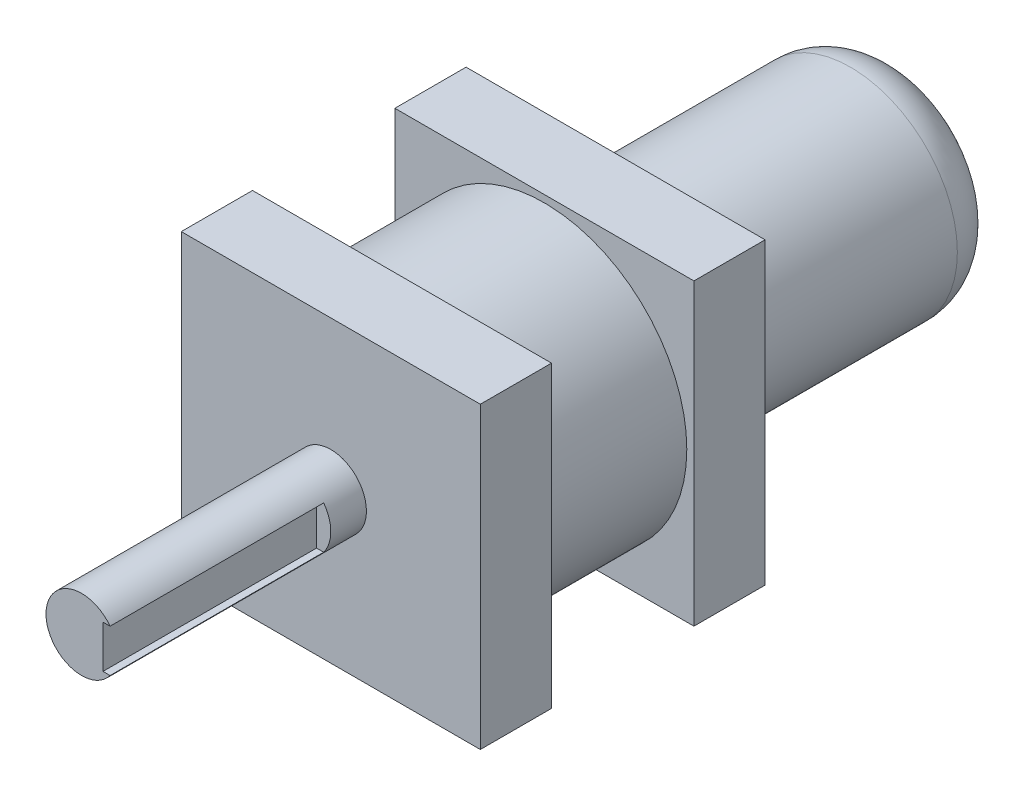
ISO-10303-21;
HEADER;
FILE_DESCRIPTION(('STEP AP214'),'2;1');
FILE_NAME('part.step','',(''),(''),'','','');
FILE_SCHEMA(('AUTOMOTIVE_DESIGN { 1 0 10303 214 1 1 1 1 }'));
ENDSEC;
DATA;
#1=APPLICATION_CONTEXT('core data for automotive mechanical design processes');
#2=APPLICATION_PROTOCOL_DEFINITION('international standard','automotive_design',2000,#1);
#3=PRODUCT_CONTEXT('',#1,'mechanical');
#4=PRODUCT('Part','Part','',(#3));
#5=PRODUCT_RELATED_PRODUCT_CATEGORY('part','',(#4));
#6=PRODUCT_DEFINITION_FORMATION('','',#4);
#7=PRODUCT_DEFINITION_CONTEXT('part definition',#1,'design');
#8=PRODUCT_DEFINITION('design','',#6,#7);
#9=PRODUCT_DEFINITION_SHAPE('','',#8);
#10=(LENGTH_UNIT() NAMED_UNIT(*) SI_UNIT(.MILLI.,.METRE.));
#11=(NAMED_UNIT(*) PLANE_ANGLE_UNIT() SI_UNIT($,.RADIAN.));
#12=(NAMED_UNIT(*) SI_UNIT($,.STERADIAN.) SOLID_ANGLE_UNIT());
#13=UNCERTAINTY_MEASURE_WITH_UNIT(LENGTH_MEASURE(1.E-05),#10,'distance_accuracy_value','');
#14=(GEOMETRIC_REPRESENTATION_CONTEXT(3) GLOBAL_UNCERTAINTY_ASSIGNED_CONTEXT((#13)) GLOBAL_UNIT_ASSIGNED_CONTEXT((#10,
#11,#12)) REPRESENTATION_CONTEXT('',''));
#15=CARTESIAN_POINT('',(0.,0.,0.));
#16=DIRECTION('',(0.,0.,1.));
#17=DIRECTION('',(1.,0.,0.));
#18=AXIS2_PLACEMENT_3D('',#15,#16,#17);
#19=CARTESIAN_POINT('',(0.,0.,40.));
#20=DIRECTION('',(0.,0.,-1.));
#21=DIRECTION('',(-1.,0.,0.));
#22=AXIS2_PLACEMENT_3D('',#19,#20,#21);
#23=CYLINDRICAL_SURFACE('',#22,15.);
#24=CARTESIAN_POINT('',(0.,0.,7.));
#25=DIRECTION('',(0.,0.,1.));
#26=DIRECTION('',(1.,0.,0.));
#27=AXIS2_PLACEMENT_3D('',#24,#25,#26);
#28=CIRCLE('',#27,15.);
#29=CARTESIAN_POINT('',(15.,0.,7.));
#30=VERTEX_POINT('',#29);
#31=EDGE_CURVE('E179',#30,#30,#28,.T.);
#32=ORIENTED_EDGE('',*,*,#31,.T.);
#33=EDGE_LOOP('',(#32));
#34=FACE_BOUND('',#33,.T.);
#35=CARTESIAN_POINT('',(0.,0.,40.));
#36=DIRECTION('',(0.,0.,1.));
#37=DIRECTION('',(1.,0.,0.));
#38=AXIS2_PLACEMENT_3D('',#35,#36,#37);
#39=CIRCLE('',#38,15.);
#40=CARTESIAN_POINT('',(15.,0.,40.));
#41=VERTEX_POINT('',#40);
#42=EDGE_CURVE('E216',#41,#41,#39,.T.);
#43=ORIENTED_EDGE('',*,*,#42,.F.);
#44=EDGE_LOOP('',(#43));
#45=FACE_BOUND('',#44,.T.);
#46=ADVANCED_FACE('F43',(#34,#45),#23,.T.);
#47=CARTESIAN_POINT('',(0.,0.,0.));
#48=DIRECTION('',(0.,0.,1.));
#49=DIRECTION('',(1.,0.,0.));
#50=AXIS2_PLACEMENT_3D('',#47,#48,#49);
#51=PLANE('',#50);
#52=CARTESIAN_POINT('',(0.,0.,0.));
#53=DIRECTION('',(0.,0.,1.));
#54=DIRECTION('',(1.,0.,0.));
#55=AXIS2_PLACEMENT_3D('',#52,#53,#54);
#56=CIRCLE('',#55,1.25);
#57=CARTESIAN_POINT('',(1.25,0.,0.));
#58=VERTEX_POINT('',#57);
#59=EDGE_CURVE('E246',#58,#58,#56,.F.);
#60=ORIENTED_EDGE('',*,*,#59,.F.);
#61=EDGE_LOOP('',(#60));
#62=FACE_BOUND('',#61,.T.);
#63=CARTESIAN_POINT('',(0.,0.,0.));
#64=DIRECTION('',(0.,0.,1.));
#65=DIRECTION('',(1.,0.,0.));
#66=AXIS2_PLACEMENT_3D('',#63,#64,#65);
#67=CIRCLE('',#66,8.);
#68=CARTESIAN_POINT('',(8.,0.,0.));
#69=VERTEX_POINT('',#68);
#70=EDGE_CURVE('E243',#69,#69,#67,.F.);
#71=ORIENTED_EDGE('',*,*,#70,.T.);
#72=EDGE_LOOP('',(#71));
#73=FACE_BOUND('',#72,.T.);
#74=ADVANCED_FACE('F273',(#62,#73),#51,.F.);
#75=CARTESIAN_POINT('',(21.,21.,50.));
#76=DIRECTION('',(-1.,0.,0.));
#77=DIRECTION('',(0.,-1.,0.));
#78=AXIS2_PLACEMENT_3D('',#75,#76,#77);
#79=PLANE('',#78);
#80=DIRECTION('',(0.,1.,0.));
#81=VECTOR('',#80,1.);
#82=CARTESIAN_POINT('',(21.,21.,40.));
#83=LINE('',#82,#81);
#84=CARTESIAN_POINT('',(21.,-21.,40.));
#85=VERTEX_POINT('',#84);
#86=CARTESIAN_POINT('',(21.,21.,40.));
#87=VERTEX_POINT('',#86);
#88=EDGE_CURVE('E213',#85,#87,#83,.T.);
#89=ORIENTED_EDGE('',*,*,#88,.T.);
#90=DIRECTION('',(0.,0.,-1.));
#91=VECTOR('',#90,1.);
#92=CARTESIAN_POINT('',(21.,21.,50.));
#93=LINE('',#92,#91);
#94=CARTESIAN_POINT('',(21.,21.,50.));
#95=VERTEX_POINT('',#94);
#96=EDGE_CURVE('E237',#95,#87,#93,.T.);
#97=ORIENTED_EDGE('',*,*,#96,.F.);
#98=DIRECTION('',(0.,1.,0.));
#99=VECTOR('',#98,1.);
#100=CARTESIAN_POINT('',(21.,21.,50.));
#101=LINE('',#100,#99);
#102=CARTESIAN_POINT('',(21.,-21.,50.));
#103=VERTEX_POINT('',#102);
#104=EDGE_CURVE('E217',#103,#95,#101,.T.);
#105=ORIENTED_EDGE('',*,*,#104,.F.);
#106=DIRECTION('',(0.,0.,-1.));
#107=VECTOR('',#106,1.);
#108=CARTESIAN_POINT('',(21.,-21.,50.));
#109=LINE('',#108,#107);
#110=EDGE_CURVE('E223',#103,#85,#109,.T.);
#111=ORIENTED_EDGE('',*,*,#110,.T.);
#112=EDGE_LOOP('',(#89,#97,#105,#111));
#113=FACE_BOUND('',#112,.T.);
#114=ADVANCED_FACE('F281',(#113),#79,.F.);
#115=CARTESIAN_POINT('',(-21.,21.,50.));
#116=DIRECTION('',(0.,-1.,0.));
#117=DIRECTION('',(0.,0.,-1.));
#118=AXIS2_PLACEMENT_3D('',#115,#116,#117);
#119=PLANE('',#118);
#120=DIRECTION('',(-1.,0.,0.));
#121=VECTOR('',#120,1.);
#122=CARTESIAN_POINT('',(-21.,21.,40.));
#123=LINE('',#122,#121);
#124=CARTESIAN_POINT('',(-21.,21.,40.));
#125=VERTEX_POINT('',#124);
#126=EDGE_CURVE('E226',#87,#125,#123,.T.);
#127=ORIENTED_EDGE('',*,*,#126,.T.);
#128=DIRECTION('',(0.,0.,-1.));
#129=VECTOR('',#128,1.);
#130=CARTESIAN_POINT('',(-21.,21.,50.));
#131=LINE('',#130,#129);
#132=CARTESIAN_POINT('',(-21.,21.,50.));
#133=VERTEX_POINT('',#132);
#134=EDGE_CURVE('E234',#133,#125,#131,.T.);
#135=ORIENTED_EDGE('',*,*,#134,.F.);
#136=DIRECTION('',(-1.,0.,0.));
#137=VECTOR('',#136,1.);
#138=CARTESIAN_POINT('',(-21.,21.,50.));
#139=LINE('',#138,#137);
#140=EDGE_CURVE('E96',#95,#133,#139,.T.);
#141=ORIENTED_EDGE('',*,*,#140,.F.);
#142=ORIENTED_EDGE('',*,*,#96,.T.);
#143=EDGE_LOOP('',(#127,#135,#141,#142));
#144=FACE_BOUND('',#143,.T.);
#145=ADVANCED_FACE('F347',(#144),#119,.F.);
#146=CARTESIAN_POINT('',(-21.,21.,50.));
#147=DIRECTION('',(1.,0.,0.));
#148=DIRECTION('',(0.,1.,0.));
#149=AXIS2_PLACEMENT_3D('',#146,#147,#148);
#150=PLANE('',#149);
#151=DIRECTION('',(0.,-1.,0.));
#152=VECTOR('',#151,1.);
#153=CARTESIAN_POINT('',(-21.,21.,40.));
#154=LINE('',#153,#152);
#155=CARTESIAN_POINT('',(-21.,-21.,40.));
#156=VERTEX_POINT('',#155);
#157=EDGE_CURVE('E228',#125,#156,#154,.T.);
#158=ORIENTED_EDGE('',*,*,#157,.T.);
#159=DIRECTION('',(0.,0.,-1.));
#160=VECTOR('',#159,1.);
#161=CARTESIAN_POINT('',(-21.,-21.,50.));
#162=LINE('',#161,#160);
#163=CARTESIAN_POINT('',(-21.,-21.,50.));
#164=VERTEX_POINT('',#163);
#165=EDGE_CURVE('E232',#164,#156,#162,.T.);
#166=ORIENTED_EDGE('',*,*,#165,.F.);
#167=DIRECTION('',(0.,-1.,0.));
#168=VECTOR('',#167,1.);
#169=CARTESIAN_POINT('',(-21.,21.,50.));
#170=LINE('',#169,#168);
#171=EDGE_CURVE('E220',#133,#164,#170,.T.);
#172=ORIENTED_EDGE('',*,*,#171,.F.);
#173=ORIENTED_EDGE('',*,*,#134,.T.);
#174=EDGE_LOOP('',(#158,#166,#172,#173));
#175=FACE_BOUND('',#174,.T.);
#176=ADVANCED_FACE('F344',(#175),#150,.F.);
#177=CARTESIAN_POINT('',(-21.,-21.,50.));
#178=DIRECTION('',(0.,1.,0.));
#179=DIRECTION('',(0.,0.,1.));
#180=AXIS2_PLACEMENT_3D('',#177,#178,#179);
#181=PLANE('',#180);
#182=DIRECTION('',(1.,0.,0.));
#183=VECTOR('',#182,1.);
#184=CARTESIAN_POINT('',(-21.,-21.,40.));
#185=LINE('',#184,#183);
#186=EDGE_CURVE('E88',#156,#85,#185,.T.);
#187=ORIENTED_EDGE('',*,*,#186,.T.);
#188=ORIENTED_EDGE('',*,*,#110,.F.);
#189=DIRECTION('',(1.,0.,0.));
#190=VECTOR('',#189,1.);
#191=CARTESIAN_POINT('',(-21.,-21.,50.));
#192=LINE('',#191,#190);
#193=EDGE_CURVE('E67',#164,#103,#192,.T.);
#194=ORIENTED_EDGE('',*,*,#193,.F.);
#195=ORIENTED_EDGE('',*,*,#165,.T.);
#196=EDGE_LOOP('',(#187,#188,#194,#195));
#197=FACE_BOUND('',#196,.T.);
#198=ADVANCED_FACE('F337',(#197),#181,.F.);
#199=CARTESIAN_POINT('',(0.,0.,50.));
#200=DIRECTION('',(0.,0.,1.));
#201=DIRECTION('',(1.,0.,0.));
#202=AXIS2_PLACEMENT_3D('',#199,#200,#201);
#203=PLANE('',#202);
#204=CARTESIAN_POINT('',(0.,0.,50.));
#205=DIRECTION('',(0.,0.,1.));
#206=DIRECTION('',(1.,0.,0.));
#207=AXIS2_PLACEMENT_3D('',#204,#205,#206);
#208=CIRCLE('',#207,20.);
#209=CARTESIAN_POINT('',(20.,0.,50.));
#210=VERTEX_POINT('',#209);
#211=EDGE_CURVE('E180',#210,#210,#208,.T.);
#212=ORIENTED_EDGE('',*,*,#211,.F.);
#213=EDGE_LOOP('',(#212));
#214=FACE_BOUND('',#213,.T.);
#215=ORIENTED_EDGE('',*,*,#104,.T.);
#216=ORIENTED_EDGE('',*,*,#140,.T.);
#217=ORIENTED_EDGE('',*,*,#171,.T.);
#218=ORIENTED_EDGE('',*,*,#193,.T.);
#219=EDGE_LOOP('',(#215,#216,#217,#218));
#220=FACE_BOUND('',#219,.T.);
#221=ADVANCED_FACE('F334',(#214,#220),#203,.T.);
#222=CARTESIAN_POINT('',(0.,0.,40.));
#223=DIRECTION('',(0.,0.,1.));
#224=DIRECTION('',(1.,0.,0.));
#225=AXIS2_PLACEMENT_3D('',#222,#223,#224);
#226=PLANE('',#225);
#227=ORIENTED_EDGE('',*,*,#42,.T.);
#228=EDGE_LOOP('',(#227));
#229=FACE_BOUND('',#228,.T.);
#230=ORIENTED_EDGE('',*,*,#88,.F.);
#231=ORIENTED_EDGE('',*,*,#186,.F.);
#232=ORIENTED_EDGE('',*,*,#157,.F.);
#233=ORIENTED_EDGE('',*,*,#126,.F.);
#234=EDGE_LOOP('',(#230,#231,#232,#233));
#235=FACE_BOUND('',#234,.T.);
#236=ADVANCED_FACE('F332',(#229,#235),#226,.F.);
#237=CARTESIAN_POINT('',(0.,0.,70.));
#238=DIRECTION('',(0.,0.,-1.));
#239=DIRECTION('',(-1.,0.,0.));
#240=AXIS2_PLACEMENT_3D('',#237,#238,#239);
#241=CYLINDRICAL_SURFACE('',#240,20.);
#242=CARTESIAN_POINT('',(0.,0.,70.));
#243=DIRECTION('',(0.,0.,1.));
#244=DIRECTION('',(1.,0.,0.));
#245=AXIS2_PLACEMENT_3D('',#242,#243,#244);
#246=CIRCLE('',#245,20.);
#247=CARTESIAN_POINT('',(20.,0.,70.));
#248=VERTEX_POINT('',#247);
#249=EDGE_CURVE('E210',#248,#248,#246,.T.);
#250=ORIENTED_EDGE('',*,*,#249,.F.);
#251=EDGE_LOOP('',(#250));
#252=FACE_BOUND('',#251,.T.);
#253=ORIENTED_EDGE('',*,*,#211,.T.);
#254=EDGE_LOOP('',(#253));
#255=FACE_BOUND('',#254,.T.);
#256=ADVANCED_FACE('F328',(#252,#255),#241,.T.);
#257=CARTESIAN_POINT('',(21.,21.,80.));
#258=DIRECTION('',(-1.,0.,0.));
#259=DIRECTION('',(0.,0.,1.));
#260=AXIS2_PLACEMENT_3D('',#257,#258,#259);
#261=PLANE('',#260);
#262=DIRECTION('',(0.,1.,0.));
#263=VECTOR('',#262,1.);
#264=CARTESIAN_POINT('',(21.,21.,70.));
#265=LINE('',#264,#263);
#266=CARTESIAN_POINT('',(21.,-21.,70.));
#267=VERTEX_POINT('',#266);
#268=CARTESIAN_POINT('',(21.,21.,70.));
#269=VERTEX_POINT('',#268);
#270=EDGE_CURVE('E175',#267,#269,#265,.T.);
#271=ORIENTED_EDGE('',*,*,#270,.T.);
#272=DIRECTION('',(0.,0.,-1.));
#273=VECTOR('',#272,1.);
#274=CARTESIAN_POINT('',(21.,21.,80.));
#275=LINE('',#274,#273);
#276=CARTESIAN_POINT('',(21.,21.,80.));
#277=VERTEX_POINT('',#276);
#278=EDGE_CURVE('E207',#277,#269,#275,.T.);
#279=ORIENTED_EDGE('',*,*,#278,.F.);
#280=DIRECTION('',(0.,1.,0.));
#281=VECTOR('',#280,1.);
#282=CARTESIAN_POINT('',(21.,21.,80.));
#283=LINE('',#282,#281);
#284=CARTESIAN_POINT('',(21.,-21.,80.));
#285=VERTEX_POINT('',#284);
#286=EDGE_CURVE('E181',#285,#277,#283,.T.);
#287=ORIENTED_EDGE('',*,*,#286,.F.);
#288=DIRECTION('',(0.,0.,-1.));
#289=VECTOR('',#288,1.);
#290=CARTESIAN_POINT('',(21.,-21.,80.));
#291=LINE('',#290,#289);
#292=EDGE_CURVE('E191',#285,#267,#291,.T.);
#293=ORIENTED_EDGE('',*,*,#292,.T.);
#294=EDGE_LOOP('',(#271,#279,#287,#293));
#295=FACE_BOUND('',#294,.T.);
#296=ADVANCED_FACE('F324',(#295),#261,.F.);
#297=CARTESIAN_POINT('',(-21.,21.,80.));
#298=DIRECTION('',(0.,-1.,0.));
#299=DIRECTION('',(0.,0.,-1.));
#300=AXIS2_PLACEMENT_3D('',#297,#298,#299);
#301=PLANE('',#300);
#302=DIRECTION('',(-1.,0.,0.));
#303=VECTOR('',#302,1.);
#304=CARTESIAN_POINT('',(-21.,21.,70.));
#305=LINE('',#304,#303);
#306=CARTESIAN_POINT('',(-21.,21.,70.));
#307=VERTEX_POINT('',#306);
#308=EDGE_CURVE('E194',#269,#307,#305,.T.);
#309=ORIENTED_EDGE('',*,*,#308,.T.);
#310=DIRECTION('',(0.,0.,-1.));
#311=VECTOR('',#310,1.);
#312=CARTESIAN_POINT('',(-21.,21.,80.));
#313=LINE('',#312,#311);
#314=CARTESIAN_POINT('',(-21.,21.,80.));
#315=VERTEX_POINT('',#314);
#316=EDGE_CURVE('E204',#315,#307,#313,.T.);
#317=ORIENTED_EDGE('',*,*,#316,.F.);
#318=DIRECTION('',(-1.,0.,0.));
#319=VECTOR('',#318,1.);
#320=CARTESIAN_POINT('',(-21.,21.,80.));
#321=LINE('',#320,#319);
#322=EDGE_CURVE('E184',#277,#315,#321,.T.);
#323=ORIENTED_EDGE('',*,*,#322,.F.);
#324=ORIENTED_EDGE('',*,*,#278,.T.);
#325=EDGE_LOOP('',(#309,#317,#323,#324));
#326=FACE_BOUND('',#325,.T.);
#327=ADVANCED_FACE('F320',(#326),#301,.F.);
#328=CARTESIAN_POINT('',(-21.,21.,80.));
#329=DIRECTION('',(1.,0.,0.));
#330=DIRECTION('',(0.,0.,-1.));
#331=AXIS2_PLACEMENT_3D('',#328,#329,#330);
#332=PLANE('',#331);
#333=DIRECTION('',(0.,-1.,0.));
#334=VECTOR('',#333,1.);
#335=CARTESIAN_POINT('',(-21.,21.,70.));
#336=LINE('',#335,#334);
#337=CARTESIAN_POINT('',(-21.,-21.,70.));
#338=VERTEX_POINT('',#337);
#339=EDGE_CURVE('E196',#307,#338,#336,.T.);
#340=ORIENTED_EDGE('',*,*,#339,.T.);
#341=DIRECTION('',(0.,0.,-1.));
#342=VECTOR('',#341,1.);
#343=CARTESIAN_POINT('',(-21.,-21.,80.));
#344=LINE('',#343,#342);
#345=CARTESIAN_POINT('',(-21.,-21.,80.));
#346=VERTEX_POINT('',#345);
#347=EDGE_CURVE('E201',#346,#338,#344,.T.);
#348=ORIENTED_EDGE('',*,*,#347,.F.);
#349=DIRECTION('',(0.,-1.,0.));
#350=VECTOR('',#349,1.);
#351=CARTESIAN_POINT('',(-21.,21.,80.));
#352=LINE('',#351,#350);
#353=EDGE_CURVE('E187',#315,#346,#352,.T.);
#354=ORIENTED_EDGE('',*,*,#353,.F.);
#355=ORIENTED_EDGE('',*,*,#316,.T.);
#356=EDGE_LOOP('',(#340,#348,#354,#355));
#357=FACE_BOUND('',#356,.T.);
#358=ADVANCED_FACE('F316',(#357),#332,.F.);
#359=CARTESIAN_POINT('',(-21.,-21.,80.));
#360=DIRECTION('',(0.,1.,0.));
#361=DIRECTION('',(0.,0.,1.));
#362=AXIS2_PLACEMENT_3D('',#359,#360,#361);
#363=PLANE('',#362);
#364=DIRECTION('',(1.,0.,0.));
#365=VECTOR('',#364,1.);
#366=CARTESIAN_POINT('',(-21.,-21.,70.));
#367=LINE('',#366,#365);
#368=EDGE_CURVE('E185',#338,#267,#367,.T.);
#369=ORIENTED_EDGE('',*,*,#368,.T.);
#370=ORIENTED_EDGE('',*,*,#292,.F.);
#371=DIRECTION('',(1.,0.,0.));
#372=VECTOR('',#371,1.);
#373=CARTESIAN_POINT('',(-21.,-21.,80.));
#374=LINE('',#373,#372);
#375=EDGE_CURVE('E189',#346,#285,#374,.T.);
#376=ORIENTED_EDGE('',*,*,#375,.F.);
#377=ORIENTED_EDGE('',*,*,#347,.T.);
#378=EDGE_LOOP('',(#369,#370,#376,#377));
#379=FACE_BOUND('',#378,.T.);
#380=ADVANCED_FACE('F309',(#379),#363,.F.);
#381=CARTESIAN_POINT('',(0.,0.,80.));
#382=DIRECTION('',(0.,0.,1.));
#383=DIRECTION('',(1.,0.,0.));
#384=AXIS2_PLACEMENT_3D('',#381,#382,#383);
#385=PLANE('',#384);
#386=CARTESIAN_POINT('',(0.,0.,80.));
#387=DIRECTION('',(0.,0.,1.));
#388=DIRECTION('',(1.,0.,0.));
#389=AXIS2_PLACEMENT_3D('',#386,#387,#388);
#390=CIRCLE('',#389,5.);
#391=CARTESIAN_POINT('',(5.,0.,80.));
#392=VERTEX_POINT('',#391);
#393=EDGE_CURVE('E176',#392,#392,#390,.T.);
#394=ORIENTED_EDGE('',*,*,#393,.F.);
#395=EDGE_LOOP('',(#394));
#396=FACE_BOUND('',#395,.T.);
#397=ORIENTED_EDGE('',*,*,#286,.T.);
#398=ORIENTED_EDGE('',*,*,#322,.T.);
#399=ORIENTED_EDGE('',*,*,#353,.T.);
#400=ORIENTED_EDGE('',*,*,#375,.T.);
#401=EDGE_LOOP('',(#397,#398,#399,#400));
#402=FACE_BOUND('',#401,.T.);
#403=ADVANCED_FACE('F307',(#396,#402),#385,.T.);
#404=CARTESIAN_POINT('',(0.,0.,70.));
#405=DIRECTION('',(0.,0.,1.));
#406=DIRECTION('',(1.,0.,0.));
#407=AXIS2_PLACEMENT_3D('',#404,#405,#406);
#408=PLANE('',#407);
#409=ORIENTED_EDGE('',*,*,#249,.T.);
#410=EDGE_LOOP('',(#409));
#411=FACE_BOUND('',#410,.T.);
#412=ORIENTED_EDGE('',*,*,#270,.F.);
#413=ORIENTED_EDGE('',*,*,#368,.F.);
#414=ORIENTED_EDGE('',*,*,#339,.F.);
#415=ORIENTED_EDGE('',*,*,#308,.F.);
#416=EDGE_LOOP('',(#412,#413,#414,#415));
#417=FACE_BOUND('',#416,.T.);
#418=ADVANCED_FACE('F302',(#411,#417),#408,.F.);
#419=CARTESIAN_POINT('',(0.,0.,115.));
#420=DIRECTION('',(0.,0.,-1.));
#421=DIRECTION('',(-1.,0.,0.));
#422=AXIS2_PLACEMENT_3D('',#419,#420,#421);
#423=CYLINDRICAL_SURFACE('',#422,5.);
#424=CARTESIAN_POINT('',(0.,0.,85.));
#425=DIRECTION('',(0.,0.,1.));
#426=DIRECTION('',(1.,0.,0.));
#427=AXIS2_PLACEMENT_3D('',#424,#425,#426);
#428=CIRCLE('',#427,5.);
#429=CARTESIAN_POINT('',(4.,-3.,85.));
#430=VERTEX_POINT('',#429);
#431=CARTESIAN_POINT('',(4.,3.,85.));
#432=VERTEX_POINT('',#431);
#433=EDGE_CURVE('E11',#430,#432,#428,.T.);
#434=ORIENTED_EDGE('',*,*,#433,.F.);
#435=DIRECTION('',(0.,0.,-1.));
#436=VECTOR('',#435,1.);
#437=CARTESIAN_POINT('',(4.,-3.,115.));
#438=LINE('',#437,#436);
#439=CARTESIAN_POINT('',(4.,-3.,115.));
#440=VERTEX_POINT('',#439);
#441=EDGE_CURVE('E169',#430,#440,#438,.F.);
#442=ORIENTED_EDGE('',*,*,#441,.T.);
#443=CARTESIAN_POINT('',(0.,0.,115.));
#444=DIRECTION('',(0.,0.,1.));
#445=DIRECTION('',(1.,0.,0.));
#446=AXIS2_PLACEMENT_3D('',#443,#444,#445);
#447=CIRCLE('',#446,5.);
#448=CARTESIAN_POINT('',(4.,3.,115.));
#449=VERTEX_POINT('',#448);
#450=EDGE_CURVE('E172',#449,#440,#447,.T.);
#451=ORIENTED_EDGE('',*,*,#450,.F.);
#452=DIRECTION('',(0.,0.,-1.));
#453=VECTOR('',#452,1.);
#454=CARTESIAN_POINT('',(4.,3.,115.));
#455=LINE('',#454,#453);
#456=EDGE_CURVE('E58',#449,#432,#455,.T.);
#457=ORIENTED_EDGE('',*,*,#456,.T.);
#458=EDGE_LOOP('',(#434,#442,#451,#457));
#459=FACE_BOUND('',#458,.T.);
#460=ORIENTED_EDGE('',*,*,#393,.T.);
#461=EDGE_LOOP('',(#460));
#462=FACE_BOUND('',#461,.T.);
#463=ADVANCED_FACE('F291',(#459,#462),#423,.T.);
#464=CARTESIAN_POINT('',(0.,0.,115.));
#465=DIRECTION('',(0.,0.,1.));
#466=DIRECTION('',(1.,0.,0.));
#467=AXIS2_PLACEMENT_3D('',#464,#465,#466);
#468=PLANE('',#467);
#469=DIRECTION('',(1.,0.,0.));
#470=VECTOR('',#469,1.);
#471=CARTESIAN_POINT('',(3.,-3.,115.));
#472=LINE('',#471,#470);
#473=CARTESIAN_POINT('',(3.,-3.,115.));
#474=VERTEX_POINT('',#473);
#475=EDGE_CURVE('E149',#474,#440,#472,.T.);
#476=ORIENTED_EDGE('',*,*,#475,.F.);
#477=DIRECTION('',(0.,-1.,0.));
#478=VECTOR('',#477,1.);
#479=CARTESIAN_POINT('',(3.,3.,115.));
#480=LINE('',#479,#478);
#481=CARTESIAN_POINT('',(3.,3.,115.));
#482=VERTEX_POINT('',#481);
#483=EDGE_CURVE('E164',#482,#474,#480,.T.);
#484=ORIENTED_EDGE('',*,*,#483,.F.);
#485=DIRECTION('',(-1.,0.,0.));
#486=VECTOR('',#485,1.);
#487=CARTESIAN_POINT('',(0.,3.,115.));
#488=LINE('',#487,#486);
#489=EDGE_CURVE('E51',#449,#482,#488,.T.);
#490=ORIENTED_EDGE('',*,*,#489,.F.);
#491=ORIENTED_EDGE('',*,*,#450,.T.);
#492=EDGE_LOOP('',(#476,#484,#490,#491));
#493=FACE_BOUND('',#492,.T.);
#494=ADVANCED_FACE('F286',(#493),#468,.T.);
#495=CARTESIAN_POINT('',(0.,0.,7.));
#496=DIRECTION('',(0.,0.,1.));
#497=DIRECTION('',(1.,0.,0.));
#498=AXIS2_PLACEMENT_3D('',#495,#496,#497);
#499=TOROIDAL_SURFACE('',#498,8.,7.);
#500=ORIENTED_EDGE('',*,*,#70,.F.);
#501=EDGE_LOOP('',(#500));
#502=FACE_BOUND('',#501,.T.);
#503=ORIENTED_EDGE('',*,*,#31,.F.);
#504=EDGE_LOOP('',(#503));
#505=FACE_BOUND('',#504,.T.);
#506=ADVANCED_FACE('F269',(#502,#505),#499,.T.);
#507=CARTESIAN_POINT('',(0.,0.,-5.));
#508=DIRECTION('',(0.,0.,1.));
#509=DIRECTION('',(1.,0.,0.));
#510=AXIS2_PLACEMENT_3D('',#507,#508,#509);
#511=CYLINDRICAL_SURFACE('',#510,1.25);
#512=CARTESIAN_POINT('',(0.,0.,-4.7));
#513=DIRECTION('',(0.,0.,-1.));
#514=DIRECTION('',(-1.,0.,0.));
#515=AXIS2_PLACEMENT_3D('',#512,#513,#514);
#516=CIRCLE('',#515,1.25);
#517=CARTESIAN_POINT('',(-1.25,0.,-4.7));
#518=VERTEX_POINT('',#517);
#519=EDGE_CURVE('E252',#518,#518,#516,.F.);
#520=ORIENTED_EDGE('',*,*,#519,.T.);
#521=EDGE_LOOP('',(#520));
#522=FACE_BOUND('',#521,.T.);
#523=ORIENTED_EDGE('',*,*,#59,.T.);
#524=EDGE_LOOP('',(#523));
#525=FACE_BOUND('',#524,.T.);
#526=ADVANCED_FACE('F256',(#522,#525),#511,.T.);
#527=CARTESIAN_POINT('',(0.,0.,-5.));
#528=DIRECTION('',(0.,0.,-1.));
#529=DIRECTION('',(-1.,0.,0.));
#530=AXIS2_PLACEMENT_3D('',#527,#528,#529);
#531=PLANE('',#530);
#532=CARTESIAN_POINT('',(0.,0.,-5.));
#533=DIRECTION('',(0.,0.,-1.));
#534=DIRECTION('',(-1.,0.,0.));
#535=AXIS2_PLACEMENT_3D('',#532,#533,#534);
#536=CIRCLE('',#535,0.95);
#537=CARTESIAN_POINT('',(-0.95,0.,-5.));
#538=VERTEX_POINT('',#537);
#539=EDGE_CURVE('E249',#538,#538,#536,.T.);
#540=ORIENTED_EDGE('',*,*,#539,.T.);
#541=EDGE_LOOP('',(#540));
#542=FACE_BOUND('',#541,.T.);
#543=ADVANCED_FACE('F261',(#542),#531,.T.);
#544=CARTESIAN_POINT('',(0.,0.,-4.7));
#545=DIRECTION('',(0.,0.,-1.));
#546=DIRECTION('',(-1.,0.,0.));
#547=AXIS2_PLACEMENT_3D('',#544,#545,#546);
#548=TOROIDAL_SURFACE('',#547,0.95,0.3);
#549=ORIENTED_EDGE('',*,*,#519,.F.);
#550=EDGE_LOOP('',(#549));
#551=FACE_BOUND('',#550,.T.);
#552=ORIENTED_EDGE('',*,*,#539,.F.);
#553=EDGE_LOOP('',(#552));
#554=FACE_BOUND('',#553,.T.);
#555=ADVANCED_FACE('F45',(#551,#554),#548,.T.);
#556=CARTESIAN_POINT('',(0.,0.,85.));
#557=DIRECTION('',(0.,0.,1.));
#558=DIRECTION('',(1.,0.,0.));
#559=AXIS2_PLACEMENT_3D('',#556,#557,#558);
#560=PLANE('',#559);
#561=ORIENTED_EDGE('',*,*,#433,.T.);
#562=DIRECTION('',(-1.,0.,0.));
#563=VECTOR('',#562,1.);
#564=CARTESIAN_POINT('',(3.,3.,85.));
#565=LINE('',#564,#563);
#566=CARTESIAN_POINT('',(3.,3.,85.));
#567=VERTEX_POINT('',#566);
#568=EDGE_CURVE('E141',#432,#567,#565,.T.);
#569=ORIENTED_EDGE('',*,*,#568,.T.);
#570=DIRECTION('',(0.,-1.,0.));
#571=VECTOR('',#570,1.);
#572=CARTESIAN_POINT('',(3.,3.,85.));
#573=LINE('',#572,#571);
#574=CARTESIAN_POINT('',(3.,-3.,85.));
#575=VERTEX_POINT('',#574);
#576=EDGE_CURVE('E146',#567,#575,#573,.T.);
#577=ORIENTED_EDGE('',*,*,#576,.T.);
#578=DIRECTION('',(1.,0.,0.));
#579=VECTOR('',#578,1.);
#580=CARTESIAN_POINT('',(3.,-3.,85.));
#581=LINE('',#580,#579);
#582=EDGE_CURVE('E158',#575,#430,#581,.T.);
#583=ORIENTED_EDGE('',*,*,#582,.T.);
#584=EDGE_LOOP('',(#561,#569,#577,#583));
#585=FACE_BOUND('',#584,.T.);
#586=ADVANCED_FACE('F143',(#585),#560,.T.);
#587=CARTESIAN_POINT('',(3.,-3.,85.));
#588=DIRECTION('',(0.,-1.,0.));
#589=DIRECTION('',(0.,0.,-1.));
#590=AXIS2_PLACEMENT_3D('',#587,#588,#589);
#591=PLANE('',#590);
#592=ORIENTED_EDGE('',*,*,#582,.F.);
#593=DIRECTION('',(0.,0.,1.));
#594=VECTOR('',#593,1.);
#595=CARTESIAN_POINT('',(3.,-3.,85.));
#596=LINE('',#595,#594);
#597=EDGE_CURVE('E157',#575,#474,#596,.T.);
#598=ORIENTED_EDGE('',*,*,#597,.T.);
#599=ORIENTED_EDGE('',*,*,#475,.T.);
#600=ORIENTED_EDGE('',*,*,#441,.F.);
#601=EDGE_LOOP('',(#592,#598,#599,#600));
#602=FACE_BOUND('',#601,.T.);
#603=ADVANCED_FACE('F459',(#602),#591,.F.);
#604=CARTESIAN_POINT('',(3.,3.,85.));
#605=DIRECTION('',(0.,1.,0.));
#606=DIRECTION('',(0.,0.,1.));
#607=AXIS2_PLACEMENT_3D('',#604,#605,#606);
#608=PLANE('',#607);
#609=ORIENTED_EDGE('',*,*,#489,.T.);
#610=DIRECTION('',(0.,0.,1.));
#611=VECTOR('',#610,1.);
#612=CARTESIAN_POINT('',(3.,3.,85.));
#613=LINE('',#612,#611);
#614=EDGE_CURVE('E152',#567,#482,#613,.T.);
#615=ORIENTED_EDGE('',*,*,#614,.F.);
#616=ORIENTED_EDGE('',*,*,#568,.F.);
#617=ORIENTED_EDGE('',*,*,#456,.F.);
#618=EDGE_LOOP('',(#609,#615,#616,#617));
#619=FACE_BOUND('',#618,.T.);
#620=ADVANCED_FACE('F153',(#619),#608,.F.);
#621=CARTESIAN_POINT('',(3.,3.,85.));
#622=DIRECTION('',(-1.,0.,0.));
#623=DIRECTION('',(0.,-1.,0.));
#624=AXIS2_PLACEMENT_3D('',#621,#622,#623);
#625=PLANE('',#624);
#626=ORIENTED_EDGE('',*,*,#483,.T.);
#627=ORIENTED_EDGE('',*,*,#597,.F.);
#628=ORIENTED_EDGE('',*,*,#576,.F.);
#629=ORIENTED_EDGE('',*,*,#614,.T.);
#630=EDGE_LOOP('',(#626,#627,#628,#629));
#631=FACE_BOUND('',#630,.T.);
#632=ADVANCED_FACE('F160',(#631),#625,.F.);
#633=CLOSED_SHELL('',(#46,#74,#114,#145,#176,#198,#221,#236,#256,#296,#327,#358,#380,#403,#418,
#463,#494,#506,#526,#543,#555,#586,#603,#620,#632));
#634=MANIFOLD_SOLID_BREP('B2',#633);
#635=ADVANCED_BREP_SHAPE_REPRESENTATION('',(#18,#634),#14);
#636=SHAPE_DEFINITION_REPRESENTATION(#9,#635);
ENDSEC;
END-ISO-10303-21;
